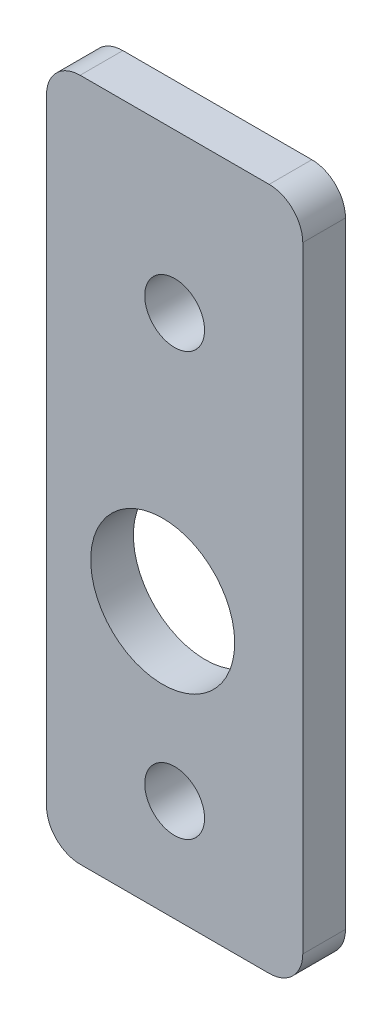
ISO-10303-21;
HEADER;
FILE_DESCRIPTION(('STEP AP214'),'2;1');
FILE_NAME('part.step','',(''),(''),'','','');
FILE_SCHEMA(('AUTOMOTIVE_DESIGN { 1 0 10303 214 1 1 1 1 }'));
ENDSEC;
DATA;
#1=APPLICATION_CONTEXT('core data for automotive mechanical design processes');
#2=APPLICATION_PROTOCOL_DEFINITION('international standard','automotive_design',2000,#1);
#3=PRODUCT_CONTEXT('',#1,'mechanical');
#4=PRODUCT('Part','Part','',(#3));
#5=PRODUCT_RELATED_PRODUCT_CATEGORY('part','',(#4));
#6=PRODUCT_DEFINITION_FORMATION('','',#4);
#7=PRODUCT_DEFINITION_CONTEXT('part definition',#1,'design');
#8=PRODUCT_DEFINITION('design','',#6,#7);
#9=PRODUCT_DEFINITION_SHAPE('','',#8);
#10=(LENGTH_UNIT() NAMED_UNIT(*) SI_UNIT(.MILLI.,.METRE.));
#11=(NAMED_UNIT(*) PLANE_ANGLE_UNIT() SI_UNIT($,.RADIAN.));
#12=(NAMED_UNIT(*) SI_UNIT($,.STERADIAN.) SOLID_ANGLE_UNIT());
#13=UNCERTAINTY_MEASURE_WITH_UNIT(LENGTH_MEASURE(1.E-05),#10,'distance_accuracy_value','');
#14=(GEOMETRIC_REPRESENTATION_CONTEXT(3) GLOBAL_UNCERTAINTY_ASSIGNED_CONTEXT((#13)) GLOBAL_UNIT_ASSIGNED_CONTEXT((#10,
#11,#12)) REPRESENTATION_CONTEXT('',''));
#15=CARTESIAN_POINT('',(0.,0.,0.));
#16=DIRECTION('',(0.,0.,1.));
#17=DIRECTION('',(1.,0.,0.));
#18=AXIS2_PLACEMENT_3D('',#15,#16,#17);
#19=CARTESIAN_POINT('',(0.,0.,6.35));
#20=DIRECTION('',(0.,0.,1.));
#21=DIRECTION('',(1.,0.,0.));
#22=AXIS2_PLACEMENT_3D('',#19,#20,#21);
#23=PLANE('',#22);
#24=CARTESIAN_POINT('',(19.05,-86.425541615591,6.35));
#25=DIRECTION('',(0.,0.,1.));
#26=DIRECTION('',(1.,0.,0.));
#27=AXIS2_PLACEMENT_3D('',#24,#25,#26);
#28=CIRCLE('',#27,4.445);
#29=CARTESIAN_POINT('',(23.495,-86.425541615591,6.35));
#30=VERTEX_POINT('',#29);
#31=EDGE_CURVE('E191',#30,#30,#28,.T.);
#32=ORIENTED_EDGE('',*,*,#31,.F.);
#33=EDGE_LOOP('',(#32));
#34=FACE_BOUND('',#33,.T.);
#35=CARTESIAN_POINT('',(19.05,-23.5883816213637,6.35));
#36=DIRECTION('',(0.,0.,1.));
#37=DIRECTION('',(1.,0.,0.));
#38=AXIS2_PLACEMENT_3D('',#35,#36,#37);
#39=CIRCLE('',#38,4.44499999999999);
#40=CARTESIAN_POINT('',(23.495,-23.5883816213637,6.35));
#41=VERTEX_POINT('',#40);
#42=EDGE_CURVE('E185',#41,#41,#39,.T.);
#43=ORIENTED_EDGE('',*,*,#42,.F.);
#44=EDGE_LOOP('',(#43));
#45=FACE_BOUND('',#44,.T.);
#46=DIRECTION('',(0.,1.,0.));
#47=VECTOR('',#46,1.);
#48=CARTESIAN_POINT('',(38.1000000000001,-101.6,6.35));
#49=LINE('',#48,#47);
#50=CARTESIAN_POINT('',(38.1000000000001,-96.6,6.35));
#51=VERTEX_POINT('',#50);
#52=CARTESIAN_POINT('',(38.1000000000001,-5.,6.35));
#53=VERTEX_POINT('',#52);
#54=EDGE_CURVE('E176',#51,#53,#49,.T.);
#55=ORIENTED_EDGE('',*,*,#54,.T.);
#56=CARTESIAN_POINT('',(33.1000000000001,-5.,6.35));
#57=DIRECTION('',(0.,0.,1.));
#58=DIRECTION('',(1.,0.,0.));
#59=AXIS2_PLACEMENT_3D('',#56,#57,#58);
#60=CIRCLE('',#59,5.);
#61=CARTESIAN_POINT('',(33.1000000000001,0.,6.35));
#62=VERTEX_POINT('',#61);
#63=EDGE_CURVE('E153',#53,#62,#60,.T.);
#64=ORIENTED_EDGE('',*,*,#63,.T.);
#65=DIRECTION('',(-1.,0.,0.));
#66=VECTOR('',#65,1.);
#67=CARTESIAN_POINT('',(38.1000000000001,0.,6.35));
#68=LINE('',#67,#66);
#69=CARTESIAN_POINT('',(5.,0.,6.35));
#70=VERTEX_POINT('',#69);
#71=EDGE_CURVE('E124',#62,#70,#68,.T.);
#72=ORIENTED_EDGE('',*,*,#71,.T.);
#73=CARTESIAN_POINT('',(5.,-5.,6.35));
#74=DIRECTION('',(0.,0.,1.));
#75=DIRECTION('',(1.,0.,0.));
#76=AXIS2_PLACEMENT_3D('',#73,#74,#75);
#77=CIRCLE('',#76,5.);
#78=CARTESIAN_POINT('',(0.,-5.,6.35));
#79=VERTEX_POINT('',#78);
#80=EDGE_CURVE('E148',#70,#79,#77,.T.);
#81=ORIENTED_EDGE('',*,*,#80,.T.);
#82=DIRECTION('',(0.,-1.,0.));
#83=VECTOR('',#82,1.);
#84=CARTESIAN_POINT('',(0.,-101.6,6.35));
#85=LINE('',#84,#83);
#86=CARTESIAN_POINT('',(0.,-96.6,6.35));
#87=VERTEX_POINT('',#86);
#88=EDGE_CURVE('E131',#79,#87,#85,.T.);
#89=ORIENTED_EDGE('',*,*,#88,.T.);
#90=CARTESIAN_POINT('',(5.00000000000002,-96.6,6.35));
#91=DIRECTION('',(0.,0.,1.));
#92=DIRECTION('',(1.,0.,0.));
#93=AXIS2_PLACEMENT_3D('',#90,#91,#92);
#94=CIRCLE('',#93,5.);
#95=CARTESIAN_POINT('',(5.00000000000002,-101.6,6.35));
#96=VERTEX_POINT('',#95);
#97=EDGE_CURVE('E60',#87,#96,#94,.T.);
#98=ORIENTED_EDGE('',*,*,#97,.T.);
#99=DIRECTION('',(1.,0.,0.));
#100=VECTOR('',#99,1.);
#101=CARTESIAN_POINT('',(38.1000000000001,-101.6,6.35));
#102=LINE('',#101,#100);
#103=CARTESIAN_POINT('',(33.1000000000001,-101.6,6.35));
#104=VERTEX_POINT('',#103);
#105=EDGE_CURVE('E134',#96,#104,#102,.T.);
#106=ORIENTED_EDGE('',*,*,#105,.T.);
#107=CARTESIAN_POINT('',(33.1000000000001,-96.6,6.35));
#108=DIRECTION('',(0.,0.,1.));
#109=DIRECTION('',(1.,0.,0.));
#110=AXIS2_PLACEMENT_3D('',#107,#108,#109);
#111=CIRCLE('',#110,5.);
#112=EDGE_CURVE('E151',#104,#51,#111,.T.);
#113=ORIENTED_EDGE('',*,*,#112,.T.);
#114=EDGE_LOOP('',(#55,#64,#72,#81,#89,#98,#106,#113));
#115=FACE_BOUND('',#114,.T.);
#116=CARTESIAN_POINT('',(17.2719999999992,-61.6,6.35));
#117=DIRECTION('',(0.,0.,1.));
#118=DIRECTION('',(1.,0.,0.));
#119=AXIS2_PLACEMENT_3D('',#116,#117,#118);
#120=CIRCLE('',#119,10.7061);
#121=CARTESIAN_POINT('',(27.9780999999992,-61.6,6.35));
#122=VERTEX_POINT('',#121);
#123=EDGE_CURVE('E169',#122,#122,#120,.T.);
#124=ORIENTED_EDGE('',*,*,#123,.F.);
#125=EDGE_LOOP('',(#124));
#126=FACE_BOUND('',#125,.T.);
#127=ADVANCED_FACE('F38',(#34,#45,#115,#126),#23,.T.);
#128=CARTESIAN_POINT('',(0.,0.,0.));
#129=DIRECTION('',(0.,0.,1.));
#130=DIRECTION('',(1.,0.,0.));
#131=AXIS2_PLACEMENT_3D('',#128,#129,#130);
#132=PLANE('',#131);
#133=CARTESIAN_POINT('',(19.05,-86.425541615591,0.));
#134=DIRECTION('',(0.,0.,1.));
#135=DIRECTION('',(1.,0.,0.));
#136=AXIS2_PLACEMENT_3D('',#133,#134,#135);
#137=CIRCLE('',#136,4.445);
#138=CARTESIAN_POINT('',(23.495,-86.425541615591,0.));
#139=VERTEX_POINT('',#138);
#140=EDGE_CURVE('E188',#139,#139,#137,.F.);
#141=ORIENTED_EDGE('',*,*,#140,.F.);
#142=EDGE_LOOP('',(#141));
#143=FACE_BOUND('',#142,.T.);
#144=CARTESIAN_POINT('',(19.05,-23.5883816213637,0.));
#145=DIRECTION('',(0.,0.,1.));
#146=DIRECTION('',(1.,0.,0.));
#147=AXIS2_PLACEMENT_3D('',#144,#145,#146);
#148=CIRCLE('',#147,4.44499999999999);
#149=CARTESIAN_POINT('',(23.495,-23.5883816213637,0.));
#150=VERTEX_POINT('',#149);
#151=EDGE_CURVE('E181',#150,#150,#148,.F.);
#152=ORIENTED_EDGE('',*,*,#151,.F.);
#153=EDGE_LOOP('',(#152));
#154=FACE_BOUND('',#153,.T.);
#155=DIRECTION('',(-1.,0.,0.));
#156=VECTOR('',#155,1.);
#157=CARTESIAN_POINT('',(38.1000000000001,0.,0.));
#158=LINE('',#157,#156);
#159=CARTESIAN_POINT('',(33.1000000000001,0.,0.));
#160=VERTEX_POINT('',#159);
#161=CARTESIAN_POINT('',(5.,0.,0.));
#162=VERTEX_POINT('',#161);
#163=EDGE_CURVE('E121',#160,#162,#158,.T.);
#164=ORIENTED_EDGE('',*,*,#163,.F.);
#165=CARTESIAN_POINT('',(33.1000000000001,-5.,0.));
#166=DIRECTION('',(0.,0.,1.));
#167=DIRECTION('',(1.,0.,0.));
#168=AXIS2_PLACEMENT_3D('',#165,#166,#167);
#169=CIRCLE('',#168,5.);
#170=CARTESIAN_POINT('',(38.1000000000001,-5.,0.));
#171=VERTEX_POINT('',#170);
#172=EDGE_CURVE('E104',#160,#171,#169,.F.);
#173=ORIENTED_EDGE('',*,*,#172,.T.);
#174=DIRECTION('',(0.,1.,0.));
#175=VECTOR('',#174,1.);
#176=CARTESIAN_POINT('',(38.1000000000001,-101.6,0.));
#177=LINE('',#176,#175);
#178=CARTESIAN_POINT('',(38.1000000000001,-96.6,0.));
#179=VERTEX_POINT('',#178);
#180=EDGE_CURVE('E132',#179,#171,#177,.T.);
#181=ORIENTED_EDGE('',*,*,#180,.F.);
#182=CARTESIAN_POINT('',(33.1000000000001,-96.6,0.));
#183=DIRECTION('',(0.,0.,1.));
#184=DIRECTION('',(1.,0.,0.));
#185=AXIS2_PLACEMENT_3D('',#182,#183,#184);
#186=CIRCLE('',#185,5.);
#187=CARTESIAN_POINT('',(33.1000000000001,-101.6,0.));
#188=VERTEX_POINT('',#187);
#189=EDGE_CURVE('E115',#179,#188,#186,.F.);
#190=ORIENTED_EDGE('',*,*,#189,.T.);
#191=DIRECTION('',(1.,0.,0.));
#192=VECTOR('',#191,1.);
#193=CARTESIAN_POINT('',(38.1000000000001,-101.6,0.));
#194=LINE('',#193,#192);
#195=CARTESIAN_POINT('',(5.00000000000002,-101.6,0.));
#196=VERTEX_POINT('',#195);
#197=EDGE_CURVE('E136',#196,#188,#194,.T.);
#198=ORIENTED_EDGE('',*,*,#197,.F.);
#199=CARTESIAN_POINT('',(5.00000000000002,-96.6,0.));
#200=DIRECTION('',(0.,0.,1.));
#201=DIRECTION('',(1.,0.,0.));
#202=AXIS2_PLACEMENT_3D('',#199,#200,#201);
#203=CIRCLE('',#202,5.);
#204=CARTESIAN_POINT('',(0.,-96.6,0.));
#205=VERTEX_POINT('',#204);
#206=EDGE_CURVE('E142',#196,#205,#203,.F.);
#207=ORIENTED_EDGE('',*,*,#206,.T.);
#208=DIRECTION('',(0.,-1.,0.));
#209=VECTOR('',#208,1.);
#210=CARTESIAN_POINT('',(0.,-101.6,0.));
#211=LINE('',#210,#209);
#212=CARTESIAN_POINT('',(0.,-5.,0.));
#213=VERTEX_POINT('',#212);
#214=EDGE_CURVE('E164',#213,#205,#211,.T.);
#215=ORIENTED_EDGE('',*,*,#214,.F.);
#216=CARTESIAN_POINT('',(5.,-5.,0.));
#217=DIRECTION('',(0.,0.,1.));
#218=DIRECTION('',(1.,0.,0.));
#219=AXIS2_PLACEMENT_3D('',#216,#217,#218);
#220=CIRCLE('',#219,5.);
#221=EDGE_CURVE('E125',#213,#162,#220,.F.);
#222=ORIENTED_EDGE('',*,*,#221,.T.);
#223=EDGE_LOOP('',(#164,#173,#181,#190,#198,#207,#215,#222));
#224=FACE_BOUND('',#223,.T.);
#225=CARTESIAN_POINT('',(17.2719999999992,-61.6,0.));
#226=DIRECTION('',(0.,0.,1.));
#227=DIRECTION('',(1.,0.,0.));
#228=AXIS2_PLACEMENT_3D('',#225,#226,#227);
#229=CIRCLE('',#228,10.7061);
#230=CARTESIAN_POINT('',(27.9780999999992,-61.6,0.));
#231=VERTEX_POINT('',#230);
#232=EDGE_CURVE('E172',#231,#231,#229,.T.);
#233=ORIENTED_EDGE('',*,*,#232,.T.);
#234=EDGE_LOOP('',(#233));
#235=FACE_BOUND('',#234,.T.);
#236=ADVANCED_FACE('F128',(#143,#154,#224,#235),#132,.F.);
#237=CARTESIAN_POINT('',(0.,-101.6,6.35));
#238=DIRECTION('',(1.,0.,0.));
#239=DIRECTION('',(0.,1.,0.));
#240=AXIS2_PLACEMENT_3D('',#237,#238,#239);
#241=PLANE('',#240);
#242=ORIENTED_EDGE('',*,*,#214,.T.);
#243=DIRECTION('',(0.,0.,-1.));
#244=VECTOR('',#243,1.);
#245=CARTESIAN_POINT('',(0.,-96.6,6.35));
#246=LINE('',#245,#244);
#247=EDGE_CURVE('E11',#205,#87,#246,.F.);
#248=ORIENTED_EDGE('',*,*,#247,.T.);
#249=ORIENTED_EDGE('',*,*,#88,.F.);
#250=DIRECTION('',(0.,0.,-1.));
#251=VECTOR('',#250,1.);
#252=CARTESIAN_POINT('',(0.,-5.,6.35));
#253=LINE('',#252,#251);
#254=EDGE_CURVE('E46',#79,#213,#253,.T.);
#255=ORIENTED_EDGE('',*,*,#254,.T.);
#256=EDGE_LOOP('',(#242,#248,#249,#255));
#257=FACE_BOUND('',#256,.T.);
#258=ADVANCED_FACE('F163',(#257),#241,.F.);
#259=CARTESIAN_POINT('',(38.1000000000001,-101.6,6.35));
#260=DIRECTION('',(0.,1.,0.));
#261=DIRECTION('',(0.,0.,1.));
#262=AXIS2_PLACEMENT_3D('',#259,#260,#261);
#263=PLANE('',#262);
#264=ORIENTED_EDGE('',*,*,#197,.T.);
#265=DIRECTION('',(0.,0.,-1.));
#266=VECTOR('',#265,1.);
#267=CARTESIAN_POINT('',(33.1000000000001,-101.6,6.35));
#268=LINE('',#267,#266);
#269=EDGE_CURVE('E53',#188,#104,#268,.F.);
#270=ORIENTED_EDGE('',*,*,#269,.T.);
#271=ORIENTED_EDGE('',*,*,#105,.F.);
#272=DIRECTION('',(0.,0.,-1.));
#273=VECTOR('',#272,1.);
#274=CARTESIAN_POINT('',(5.00000000000002,-101.6,6.35));
#275=LINE('',#274,#273);
#276=EDGE_CURVE('E155',#96,#196,#275,.T.);
#277=ORIENTED_EDGE('',*,*,#276,.T.);
#278=EDGE_LOOP('',(#264,#270,#271,#277));
#279=FACE_BOUND('',#278,.T.);
#280=ADVANCED_FACE('F218',(#279),#263,.F.);
#281=CARTESIAN_POINT('',(38.1000000000001,-101.6,6.35));
#282=DIRECTION('',(-1.,0.,0.));
#283=DIRECTION('',(0.,0.,1.));
#284=AXIS2_PLACEMENT_3D('',#281,#282,#283);
#285=PLANE('',#284);
#286=ORIENTED_EDGE('',*,*,#180,.T.);
#287=DIRECTION('',(0.,0.,-1.));
#288=VECTOR('',#287,1.);
#289=CARTESIAN_POINT('',(38.1000000000001,-5.,6.35));
#290=LINE('',#289,#288);
#291=EDGE_CURVE('E109',#171,#53,#290,.F.);
#292=ORIENTED_EDGE('',*,*,#291,.T.);
#293=ORIENTED_EDGE('',*,*,#54,.F.);
#294=DIRECTION('',(0.,0.,-1.));
#295=VECTOR('',#294,1.);
#296=CARTESIAN_POINT('',(38.1000000000001,-96.6,6.35));
#297=LINE('',#296,#295);
#298=EDGE_CURVE('E114',#51,#179,#297,.T.);
#299=ORIENTED_EDGE('',*,*,#298,.T.);
#300=EDGE_LOOP('',(#286,#292,#293,#299));
#301=FACE_BOUND('',#300,.T.);
#302=ADVANCED_FACE('F225',(#301),#285,.F.);
#303=CARTESIAN_POINT('',(38.1000000000001,0.,6.35));
#304=DIRECTION('',(0.,-1.,0.));
#305=DIRECTION('',(0.,0.,-1.));
#306=AXIS2_PLACEMENT_3D('',#303,#304,#305);
#307=PLANE('',#306);
#308=ORIENTED_EDGE('',*,*,#71,.F.);
#309=DIRECTION('',(0.,0.,-1.));
#310=VECTOR('',#309,1.);
#311=CARTESIAN_POINT('',(33.1000000000001,0.,6.35));
#312=LINE('',#311,#310);
#313=EDGE_CURVE('E108',#62,#160,#312,.T.);
#314=ORIENTED_EDGE('',*,*,#313,.T.);
#315=ORIENTED_EDGE('',*,*,#163,.T.);
#316=DIRECTION('',(0.,0.,-1.));
#317=VECTOR('',#316,1.);
#318=CARTESIAN_POINT('',(5.,0.,6.35));
#319=LINE('',#318,#317);
#320=EDGE_CURVE('E126',#162,#70,#319,.F.);
#321=ORIENTED_EDGE('',*,*,#320,.T.);
#322=EDGE_LOOP('',(#308,#314,#315,#321));
#323=FACE_BOUND('',#322,.T.);
#324=ADVANCED_FACE('F120',(#323),#307,.F.);
#325=CARTESIAN_POINT('',(17.2719999999992,-61.6,6.35));
#326=DIRECTION('',(0.,0.,-1.));
#327=DIRECTION('',(-1.,0.,0.));
#328=AXIS2_PLACEMENT_3D('',#325,#326,#327);
#329=CYLINDRICAL_SURFACE('',#328,10.7061);
#330=ORIENTED_EDGE('',*,*,#123,.T.);
#331=EDGE_LOOP('',(#330));
#332=FACE_BOUND('',#331,.T.);
#333=ORIENTED_EDGE('',*,*,#232,.F.);
#334=EDGE_LOOP('',(#333));
#335=FACE_BOUND('',#334,.T.);
#336=ADVANCED_FACE('F206',(#332,#335),#329,.F.);
#337=CARTESIAN_POINT('',(19.05,-23.5883816213637,-0.00100000000000013));
#338=DIRECTION('',(0.,0.,1.));
#339=DIRECTION('',(1.,0.,0.));
#340=AXIS2_PLACEMENT_3D('',#337,#338,#339);
#341=CYLINDRICAL_SURFACE('',#340,4.44499999999999);
#342=ORIENTED_EDGE('',*,*,#42,.T.);
#343=EDGE_LOOP('',(#342));
#344=FACE_BOUND('',#343,.T.);
#345=ORIENTED_EDGE('',*,*,#151,.T.);
#346=EDGE_LOOP('',(#345));
#347=FACE_BOUND('',#346,.T.);
#348=ADVANCED_FACE('F209',(#344,#347),#341,.F.);
#349=CARTESIAN_POINT('',(19.05,-86.425541615591,-0.00100000000000013));
#350=DIRECTION('',(0.,0.,1.));
#351=DIRECTION('',(1.,0.,0.));
#352=AXIS2_PLACEMENT_3D('',#349,#350,#351);
#353=CYLINDRICAL_SURFACE('',#352,4.445);
#354=ORIENTED_EDGE('',*,*,#31,.T.);
#355=EDGE_LOOP('',(#354));
#356=FACE_BOUND('',#355,.T.);
#357=ORIENTED_EDGE('',*,*,#140,.T.);
#358=EDGE_LOOP('',(#357));
#359=FACE_BOUND('',#358,.T.);
#360=ADVANCED_FACE('F195',(#356,#359),#353,.F.);
#361=CARTESIAN_POINT('',(33.1000000000001,-5.,6.35));
#362=DIRECTION('',(0.,0.,-1.));
#363=DIRECTION('',(-1.,0.,0.));
#364=AXIS2_PLACEMENT_3D('',#361,#362,#363);
#365=CYLINDRICAL_SURFACE('',#364,5.);
#366=ORIENTED_EDGE('',*,*,#63,.F.);
#367=ORIENTED_EDGE('',*,*,#291,.F.);
#368=ORIENTED_EDGE('',*,*,#172,.F.);
#369=ORIENTED_EDGE('',*,*,#313,.F.);
#370=EDGE_LOOP('',(#366,#367,#368,#369));
#371=FACE_BOUND('',#370,.T.);
#372=ADVANCED_FACE('F107',(#371),#365,.T.);
#373=CARTESIAN_POINT('',(33.1000000000001,-96.6,6.35));
#374=DIRECTION('',(0.,0.,-1.));
#375=DIRECTION('',(-1.,0.,0.));
#376=AXIS2_PLACEMENT_3D('',#373,#374,#375);
#377=CYLINDRICAL_SURFACE('',#376,5.);
#378=ORIENTED_EDGE('',*,*,#112,.F.);
#379=ORIENTED_EDGE('',*,*,#269,.F.);
#380=ORIENTED_EDGE('',*,*,#189,.F.);
#381=ORIENTED_EDGE('',*,*,#298,.F.);
#382=EDGE_LOOP('',(#378,#379,#380,#381));
#383=FACE_BOUND('',#382,.T.);
#384=ADVANCED_FACE('F233',(#383),#377,.T.);
#385=CARTESIAN_POINT('',(5.00000000000002,-96.6,6.35));
#386=DIRECTION('',(0.,0.,-1.));
#387=DIRECTION('',(-1.,0.,0.));
#388=AXIS2_PLACEMENT_3D('',#385,#386,#387);
#389=CYLINDRICAL_SURFACE('',#388,5.);
#390=ORIENTED_EDGE('',*,*,#97,.F.);
#391=ORIENTED_EDGE('',*,*,#247,.F.);
#392=ORIENTED_EDGE('',*,*,#206,.F.);
#393=ORIENTED_EDGE('',*,*,#276,.F.);
#394=EDGE_LOOP('',(#390,#391,#392,#393));
#395=FACE_BOUND('',#394,.T.);
#396=ADVANCED_FACE('F235',(#395),#389,.T.);
#397=CARTESIAN_POINT('',(5.,-5.,6.35));
#398=DIRECTION('',(0.,0.,-1.));
#399=DIRECTION('',(-1.,0.,0.));
#400=AXIS2_PLACEMENT_3D('',#397,#398,#399);
#401=CYLINDRICAL_SURFACE('',#400,5.);
#402=ORIENTED_EDGE('',*,*,#80,.F.);
#403=ORIENTED_EDGE('',*,*,#320,.F.);
#404=ORIENTED_EDGE('',*,*,#221,.F.);
#405=ORIENTED_EDGE('',*,*,#254,.F.);
#406=EDGE_LOOP('',(#402,#403,#404,#405));
#407=FACE_BOUND('',#406,.T.);
#408=ADVANCED_FACE('F40',(#407),#401,.T.);
#409=CLOSED_SHELL('',(#127,#236,#258,#280,#302,#324,#336,#348,#360,#372,#384,#396,#408));
#410=MANIFOLD_SOLID_BREP('B2',#409);
#411=ADVANCED_BREP_SHAPE_REPRESENTATION('',(#18,#410),#14);
#412=SHAPE_DEFINITION_REPRESENTATION(#9,#411);
ENDSEC;
END-ISO-10303-21;
